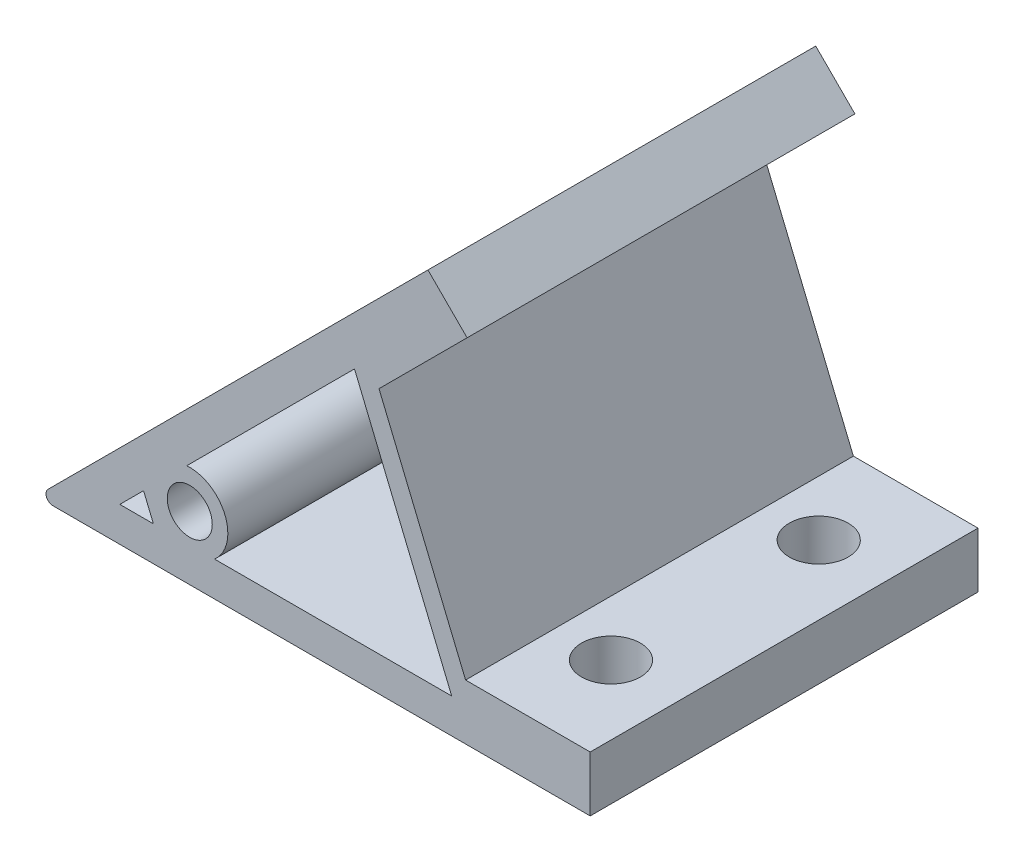
ISO-10303-21;
HEADER;
FILE_DESCRIPTION(('STEP AP214'),'2;1');
FILE_NAME('part.step','',(''),(''),'','','');
FILE_SCHEMA(('AUTOMOTIVE_DESIGN { 1 0 10303 214 1 1 1 1 }'));
ENDSEC;
DATA;
#1=APPLICATION_CONTEXT('core data for automotive mechanical design processes');
#2=APPLICATION_PROTOCOL_DEFINITION('international standard','automotive_design',2000,#1);
#3=PRODUCT_CONTEXT('',#1,'mechanical');
#4=PRODUCT('Part','Part','',(#3));
#5=PRODUCT_RELATED_PRODUCT_CATEGORY('part','',(#4));
#6=PRODUCT_DEFINITION_FORMATION('','',#4);
#7=PRODUCT_DEFINITION_CONTEXT('part definition',#1,'design');
#8=PRODUCT_DEFINITION('design','',#6,#7);
#9=PRODUCT_DEFINITION_SHAPE('','',#8);
#10=(LENGTH_UNIT() NAMED_UNIT(*) SI_UNIT(.MILLI.,.METRE.));
#11=(NAMED_UNIT(*) PLANE_ANGLE_UNIT() SI_UNIT($,.RADIAN.));
#12=(NAMED_UNIT(*) SI_UNIT($,.STERADIAN.) SOLID_ANGLE_UNIT());
#13=UNCERTAINTY_MEASURE_WITH_UNIT(LENGTH_MEASURE(1.E-05),#10,'distance_accuracy_value','');
#14=(GEOMETRIC_REPRESENTATION_CONTEXT(3) GLOBAL_UNCERTAINTY_ASSIGNED_CONTEXT((#13)) GLOBAL_UNIT_ASSIGNED_CONTEXT((#10,
#11,#12)) REPRESENTATION_CONTEXT('',''));
#15=CARTESIAN_POINT('',(0.,0.,0.));
#16=DIRECTION('',(0.,0.,1.));
#17=DIRECTION('',(1.,0.,0.));
#18=AXIS2_PLACEMENT_3D('',#15,#16,#17);
#19=CARTESIAN_POINT('',(-30.4993179415646,38.1869735594505,28.));
#20=DIRECTION('',(-0.707106781186548,0.707106781186547,0.));
#21=DIRECTION('',(-0.707106781186547,-0.707106781186548,0.));
#22=AXIS2_PLACEMENT_3D('',#19,#20,#21);
#23=PLANE('',#22);
#24=CARTESIAN_POINT('',(-24.8456710674492,43.8406204335659,15.));
#25=DIRECTION('',(-0.70710678118655,0.707106781186545,0.));
#26=DIRECTION('',(-0.707106781186546,-0.707106781186549,0.));
#27=AXIS2_PLACEMENT_3D('',#24,#25,#26);
#28=CIRCLE('',#27,4.25);
#29=CARTESIAN_POINT('',(-27.850874887492,40.835416613523,15.));
#30=VERTEX_POINT('',#29);
#31=EDGE_CURVE('E263',#30,#30,#28,.T.);
#32=ORIENTED_EDGE('',*,*,#31,.T.);
#33=EDGE_LOOP('',(#32));
#34=FACE_BOUND('',#33,.T.);
#35=DIRECTION('',(0.707106781186547,0.707106781186548,0.));
#36=VECTOR('',#35,1.);
#37=CARTESIAN_POINT('',(-30.4993179415646,38.1869735594505,-28.));
#38=LINE('',#37,#36);
#39=CARTESIAN_POINT('',(-30.4993179415646,38.1869735594505,-28.));
#40=VERTEX_POINT('',#39);
#41=CARTESIAN_POINT('',(-17.7746032555838,50.9116882454314,-28.));
#42=VERTEX_POINT('',#41);
#43=EDGE_CURVE('E237',#40,#42,#38,.T.);
#44=ORIENTED_EDGE('',*,*,#43,.T.);
#45=DIRECTION('',(0.,0.,-1.));
#46=VECTOR('',#45,1.);
#47=CARTESIAN_POINT('',(-17.7746032555838,50.9116882454314,28.));
#48=LINE('',#47,#46);
#49=CARTESIAN_POINT('',(-17.7746032555838,50.9116882454314,28.));
#50=VERTEX_POINT('',#49);
#51=EDGE_CURVE('E247',#50,#42,#48,.T.);
#52=ORIENTED_EDGE('',*,*,#51,.F.);
#53=DIRECTION('',(0.707106781186547,0.707106781186548,0.));
#54=VECTOR('',#53,1.);
#55=CARTESIAN_POINT('',(-30.4993179415646,38.1869735594505,28.));
#56=LINE('',#55,#54);
#57=CARTESIAN_POINT('',(-30.4993179415646,38.1869735594505,28.));
#58=VERTEX_POINT('',#57);
#59=EDGE_CURVE('E220',#58,#50,#56,.T.);
#60=ORIENTED_EDGE('',*,*,#59,.F.);
#61=DIRECTION('',(0.,0.,-1.));
#62=VECTOR('',#61,1.);
#63=CARTESIAN_POINT('',(-30.4993179415646,38.1869735594505,28.));
#64=LINE('',#63,#62);
#65=EDGE_CURVE('E250',#58,#40,#64,.T.);
#66=ORIENTED_EDGE('',*,*,#65,.T.);
#67=EDGE_LOOP('',(#44,#52,#60,#66));
#68=FACE_BOUND('',#67,.T.);
#69=CARTESIAN_POINT('',(-24.8456710674492,43.8406204335659,-15.));
#70=DIRECTION('',(-0.70710678118655,0.707106781186545,0.));
#71=DIRECTION('',(0.707106781186546,0.707106781186549,0.));
#72=AXIS2_PLACEMENT_3D('',#69,#70,#71);
#73=CIRCLE('',#72,4.25);
#74=CARTESIAN_POINT('',(-21.8404672474063,46.8458242536087,-15.));
#75=VERTEX_POINT('',#74);
#76=EDGE_CURVE('E274',#75,#75,#73,.T.);
#77=ORIENTED_EDGE('',*,*,#76,.T.);
#78=EDGE_LOOP('',(#77));
#79=FACE_BOUND('',#78,.T.);
#80=ADVANCED_FACE('F35',(#34,#68,#79),#23,.F.);
#81=CARTESIAN_POINT('',(-78.2928932188134,1.7071067811866,28.));
#82=DIRECTION('',(0.707106781186548,-0.707106781186548,0.));
#83=DIRECTION('',(0.707106781186547,0.707106781186548,0.));
#84=AXIS2_PLACEMENT_3D('',#81,#82,#83);
#85=PLANE('',#84);
#86=CARTESIAN_POINT('',(-30.5025253169417,49.4974746830583,15.));
#87=DIRECTION('',(0.707106781186548,-0.707106781186548,0.));
#88=DIRECTION('',(0.707106781186547,0.707106781186548,0.));
#89=AXIS2_PLACEMENT_3D('',#86,#87,#88);
#90=CIRCLE('',#89,4.25);
#91=CARTESIAN_POINT('',(-27.4973214968988,52.5026785031012,15.));
#92=VERTEX_POINT('',#91);
#93=EDGE_CURVE('E260',#92,#92,#90,.F.);
#94=ORIENTED_EDGE('',*,*,#93,.F.);
#95=EDGE_LOOP('',(#94));
#96=FACE_BOUND('',#95,.T.);
#97=DIRECTION('',(-0.707106781186547,-0.707106781186548,0.));
#98=VECTOR('',#97,1.);
#99=CARTESIAN_POINT('',(-78.2928932188134,1.7071067811866,-28.));
#100=LINE('',#99,#98);
#101=CARTESIAN_POINT('',(-23.4314575050762,56.5685424949238,-28.));
#102=VERTEX_POINT('',#101);
#103=CARTESIAN_POINT('',(-78.2928932188134,1.7071067811866,-28.));
#104=VERTEX_POINT('',#103);
#105=EDGE_CURVE('E212',#102,#104,#100,.T.);
#106=ORIENTED_EDGE('',*,*,#105,.T.);
#107=DIRECTION('',(0.,0.,-1.));
#108=VECTOR('',#107,1.);
#109=CARTESIAN_POINT('',(-78.2928932188134,1.7071067811866,28.));
#110=LINE('',#109,#108);
#111=CARTESIAN_POINT('',(-78.2928932188134,1.7071067811866,28.));
#112=VERTEX_POINT('',#111);
#113=EDGE_CURVE('E226',#112,#104,#110,.T.);
#114=ORIENTED_EDGE('',*,*,#113,.F.);
#115=DIRECTION('',(-0.707106781186547,-0.707106781186548,0.));
#116=VECTOR('',#115,1.);
#117=CARTESIAN_POINT('',(-78.2928932188134,1.7071067811866,28.));
#118=LINE('',#117,#116);
#119=CARTESIAN_POINT('',(-23.4314575050762,56.5685424949238,28.));
#120=VERTEX_POINT('',#119);
#121=EDGE_CURVE('E224',#120,#112,#118,.T.);
#122=ORIENTED_EDGE('',*,*,#121,.F.);
#123=DIRECTION('',(0.,0.,-1.));
#124=VECTOR('',#123,1.);
#125=CARTESIAN_POINT('',(-23.4314575050762,56.5685424949238,28.));
#126=LINE('',#125,#124);
#127=EDGE_CURVE('E244',#120,#102,#126,.T.);
#128=ORIENTED_EDGE('',*,*,#127,.T.);
#129=EDGE_LOOP('',(#106,#114,#122,#128));
#130=FACE_BOUND('',#129,.T.);
#131=CARTESIAN_POINT('',(-30.5025253169417,49.4974746830583,-15.));
#132=DIRECTION('',(0.707106781186548,-0.707106781186548,0.));
#133=DIRECTION('',(0.707106781186547,0.707106781186548,0.));
#134=AXIS2_PLACEMENT_3D('',#131,#132,#133);
#135=CIRCLE('',#134,4.25);
#136=CARTESIAN_POINT('',(-27.4973214968988,52.5026785031012,-15.));
#137=VERTEX_POINT('',#136);
#138=EDGE_CURVE('E39',#137,#137,#135,.F.);
#139=ORIENTED_EDGE('',*,*,#138,.F.);
#140=EDGE_LOOP('',(#139));
#141=FACE_BOUND('',#140,.T.);
#142=ADVANCED_FACE('F308',(#96,#130,#141),#85,.F.);
#143=CARTESIAN_POINT('',(-77.5857864376269,1.,28.));
#144=DIRECTION('',(0.,0.,1.));
#145=DIRECTION('',(1.,0.,0.));
#146=AXIS2_PLACEMENT_3D('',#143,#144,#145);
#147=PLANE('',#146);
#148=DIRECTION('',(1.,0.,0.));
#149=VECTOR('',#148,1.);
#150=CARTESIAN_POINT('',(-54.2574687525298,5.,28.));
#151=LINE('',#150,#149);
#152=CARTESIAN_POINT('',(-54.2574687525298,5.,28.));
#153=VERTEX_POINT('',#152);
#154=CARTESIAN_POINT('',(-20.,5.,28.));
#155=VERTEX_POINT('',#154);
#156=EDGE_CURVE('E152',#153,#155,#151,.T.);
#157=ORIENTED_EDGE('',*,*,#156,.F.);
#158=CARTESIAN_POINT('',(-57.8268912197291,9.18440237676214,28.));
#159=DIRECTION('',(0.,0.,-1.));
#160=DIRECTION('',(1.,0.,0.));
#161=AXIS2_PLACEMENT_3D('',#158,#159,#160);
#162=CIRCLE('',#161,5.49999999999996);
#163=CARTESIAN_POINT('',(-58.2617476840749,14.6671845040599,28.));
#164=VERTEX_POINT('',#163);
#165=EDGE_CURVE('E144',#164,#153,#162,.T.);
#166=ORIENTED_EDGE('',*,*,#165,.F.);
#167=DIRECTION('',(-0.707106781186549,-0.707106781186546,0.));
#168=VECTOR('',#167,1.);
#169=CARTESIAN_POINT('',(-58.2617476840749,14.6671845040599,28.));
#170=LINE('',#169,#168);
#171=CARTESIAN_POINT('',(-34.0380592228744,38.8908729652603,28.));
#172=VERTEX_POINT('',#171);
#173=EDGE_CURVE('E168',#172,#164,#170,.T.);
#174=ORIENTED_EDGE('',*,*,#173,.F.);
#175=DIRECTION('',(-0.382683432365087,0.923879532511288,0.));
#176=VECTOR('',#175,1.);
#177=CARTESIAN_POINT('',(-20.,5.,28.));
#178=LINE('',#177,#176);
#179=EDGE_CURVE('E166',#155,#172,#178,.T.);
#180=ORIENTED_EDGE('',*,*,#179,.F.);
#181=EDGE_LOOP('',(#157,#166,#174,#180));
#182=FACE_BOUND('',#181,.T.);
#183=CARTESIAN_POINT('',(-77.5857864376269,1.,28.));
#184=DIRECTION('',(0.,0.,1.));
#185=DIRECTION('',(1.,0.,0.));
#186=AXIS2_PLACEMENT_3D('',#183,#184,#185);
#187=CIRCLE('',#186,1.);
#188=CARTESIAN_POINT('',(-77.5857864376269,0.,28.));
#189=VERTEX_POINT('',#188);
#190=EDGE_CURVE('E208',#112,#189,#187,.T.);
#191=ORIENTED_EDGE('',*,*,#190,.T.);
#192=DIRECTION('',(1.,0.,0.));
#193=VECTOR('',#192,1.);
#194=CARTESIAN_POINT('',(-77.5857864376269,0.,28.));
#195=LINE('',#194,#193);
#196=CARTESIAN_POINT('',(0.,0.,28.));
#197=VERTEX_POINT('',#196);
#198=EDGE_CURVE('E211',#189,#197,#195,.T.);
#199=ORIENTED_EDGE('',*,*,#198,.T.);
#200=DIRECTION('',(0.,1.,0.));
#201=VECTOR('',#200,1.);
#202=CARTESIAN_POINT('',(0.,0.,28.));
#203=LINE('',#202,#201);
#204=CARTESIAN_POINT('',(0.,8.,28.));
#205=VERTEX_POINT('',#204);
#206=EDGE_CURVE('E214',#197,#205,#203,.T.);
#207=ORIENTED_EDGE('',*,*,#206,.T.);
#208=DIRECTION('',(-1.,0.,0.));
#209=VECTOR('',#208,1.);
#210=CARTESIAN_POINT('',(-17.995464086242,8.00000000000012,28.));
#211=LINE('',#210,#209);
#212=CARTESIAN_POINT('',(-17.995464086242,8.00000000000012,28.));
#213=VERTEX_POINT('',#212);
#214=EDGE_CURVE('E216',#205,#213,#211,.T.);
#215=ORIENTED_EDGE('',*,*,#214,.T.);
#216=DIRECTION('',(-0.382683432365096,0.923879532511284,0.));
#217=VECTOR('',#216,1.);
#218=CARTESIAN_POINT('',(-17.995464086242,8.00000000000012,28.));
#219=LINE('',#218,#217);
#220=EDGE_CURVE('E218',#213,#58,#219,.T.);
#221=ORIENTED_EDGE('',*,*,#220,.T.);
#222=ORIENTED_EDGE('',*,*,#59,.T.);
#223=DIRECTION('',(-0.707106781186548,0.707106781186547,0.));
#224=VECTOR('',#223,1.);
#225=CARTESIAN_POINT('',(-17.7746032555838,50.9116882454314,28.));
#226=LINE('',#225,#224);
#227=EDGE_CURVE('E222',#50,#120,#226,.T.);
#228=ORIENTED_EDGE('',*,*,#227,.T.);
#229=ORIENTED_EDGE('',*,*,#121,.T.);
#230=EDGE_LOOP('',(#191,#199,#207,#215,#221,#222,#228,#229));
#231=FACE_BOUND('',#230,.T.);
#232=DIRECTION('',(1.,0.,0.));
#233=VECTOR('',#232,1.);
#234=CARTESIAN_POINT('',(-67.9289321881347,5.,28.));
#235=LINE('',#234,#233);
#236=CARTESIAN_POINT('',(-67.9289321881347,5.,28.));
#237=VERTEX_POINT('',#236);
#238=CARTESIAN_POINT('',(-63.0744704704145,5.00000000000011,28.));
#239=VERTEX_POINT('',#238);
#240=EDGE_CURVE('E186',#237,#239,#235,.T.);
#241=ORIENTED_EDGE('',*,*,#240,.F.);
#242=DIRECTION('',(-0.70710678118656,-0.707106781186535,0.));
#243=VECTOR('',#242,1.);
#244=CARTESIAN_POINT('',(-67.9289321881347,5.,28.));
#245=LINE('',#244,#243);
#246=CARTESIAN_POINT('',(-64.4963093885244,8.43262279961016,28.));
#247=VERTEX_POINT('',#246);
#248=EDGE_CURVE('E184',#247,#237,#245,.T.);
#249=ORIENTED_EDGE('',*,*,#248,.F.);
#250=DIRECTION('',(-0.382683432365157,0.923879532511259,0.));
#251=VECTOR('',#250,1.);
#252=CARTESIAN_POINT('',(-63.0744704704145,5.00000000000011,28.));
#253=LINE('',#252,#251);
#254=EDGE_CURVE('E190',#239,#247,#253,.T.);
#255=ORIENTED_EDGE('',*,*,#254,.F.);
#256=EDGE_LOOP('',(#241,#249,#255));
#257=FACE_BOUND('',#256,.T.);
#258=CARTESIAN_POINT('',(-57.8268912197291,9.18440237676214,28.));
#259=DIRECTION('',(0.,0.,1.));
#260=DIRECTION('',(1.,0.,0.));
#261=AXIS2_PLACEMENT_3D('',#258,#259,#260);
#262=CIRCLE('',#261,3.25);
#263=CARTESIAN_POINT('',(-54.5768912197291,9.18440237676214,28.));
#264=VERTEX_POINT('',#263);
#265=EDGE_CURVE('E174',#264,#264,#262,.T.);
#266=ORIENTED_EDGE('',*,*,#265,.F.);
#267=EDGE_LOOP('',(#266));
#268=FACE_BOUND('',#267,.T.);
#269=ADVANCED_FACE('F164',(#182,#231,#257,#268),#147,.T.);
#270=CARTESIAN_POINT('',(-77.5857864376269,1.,-28.));
#271=DIRECTION('',(0.,0.,1.));
#272=DIRECTION('',(1.,0.,0.));
#273=AXIS2_PLACEMENT_3D('',#270,#271,#272);
#274=PLANE('',#273);
#275=CARTESIAN_POINT('',(-57.8268912197291,9.18440237676214,-28.));
#276=DIRECTION('',(0.,0.,-1.));
#277=DIRECTION('',(1.,0.,0.));
#278=AXIS2_PLACEMENT_3D('',#275,#276,#277);
#279=CIRCLE('',#278,5.49999999999996);
#280=CARTESIAN_POINT('',(-58.2617476840749,14.6671845040599,-28.));
#281=VERTEX_POINT('',#280);
#282=CARTESIAN_POINT('',(-54.2574687525298,5.,-28.));
#283=VERTEX_POINT('',#282);
#284=EDGE_CURVE('E60',#281,#283,#279,.T.);
#285=ORIENTED_EDGE('',*,*,#284,.T.);
#286=DIRECTION('',(1.,0.,0.));
#287=VECTOR('',#286,1.);
#288=CARTESIAN_POINT('',(-54.2574687525298,5.,-28.));
#289=LINE('',#288,#287);
#290=CARTESIAN_POINT('',(-20.,5.,-28.));
#291=VERTEX_POINT('',#290);
#292=EDGE_CURVE('E159',#283,#291,#289,.T.);
#293=ORIENTED_EDGE('',*,*,#292,.T.);
#294=DIRECTION('',(-0.382683432365087,0.923879532511288,0.));
#295=VECTOR('',#294,1.);
#296=CARTESIAN_POINT('',(-20.,5.,-28.));
#297=LINE('',#296,#295);
#298=CARTESIAN_POINT('',(-34.0380592228744,38.8908729652603,-28.));
#299=VERTEX_POINT('',#298);
#300=EDGE_CURVE('E176',#291,#299,#297,.T.);
#301=ORIENTED_EDGE('',*,*,#300,.T.);
#302=DIRECTION('',(-0.707106781186549,-0.707106781186546,0.));
#303=VECTOR('',#302,1.);
#304=CARTESIAN_POINT('',(-58.2617476840749,14.6671845040599,-28.));
#305=LINE('',#304,#303);
#306=EDGE_CURVE('E153',#299,#281,#305,.T.);
#307=ORIENTED_EDGE('',*,*,#306,.T.);
#308=EDGE_LOOP('',(#285,#293,#301,#307));
#309=FACE_BOUND('',#308,.T.);
#310=CARTESIAN_POINT('',(-77.5857864376269,1.,-28.));
#311=DIRECTION('',(0.,0.,1.));
#312=DIRECTION('',(1.,0.,0.));
#313=AXIS2_PLACEMENT_3D('',#310,#311,#312);
#314=CIRCLE('',#313,1.);
#315=CARTESIAN_POINT('',(-77.5857864376269,0.,-28.));
#316=VERTEX_POINT('',#315);
#317=EDGE_CURVE('E207',#104,#316,#314,.T.);
#318=ORIENTED_EDGE('',*,*,#317,.F.);
#319=ORIENTED_EDGE('',*,*,#105,.F.);
#320=DIRECTION('',(-0.707106781186548,0.707106781186547,0.));
#321=VECTOR('',#320,1.);
#322=CARTESIAN_POINT('',(-17.7746032555838,50.9116882454314,-28.));
#323=LINE('',#322,#321);
#324=EDGE_CURVE('E239',#42,#102,#323,.T.);
#325=ORIENTED_EDGE('',*,*,#324,.F.);
#326=ORIENTED_EDGE('',*,*,#43,.F.);
#327=DIRECTION('',(-0.382683432365096,0.923879532511284,0.));
#328=VECTOR('',#327,1.);
#329=CARTESIAN_POINT('',(-17.995464086242,8.00000000000012,-28.));
#330=LINE('',#329,#328);
#331=CARTESIAN_POINT('',(-17.995464086242,8.00000000000012,-28.));
#332=VERTEX_POINT('',#331);
#333=EDGE_CURVE('E235',#332,#40,#330,.T.);
#334=ORIENTED_EDGE('',*,*,#333,.F.);
#335=DIRECTION('',(-1.,0.,0.));
#336=VECTOR('',#335,1.);
#337=CARTESIAN_POINT('',(-17.995464086242,8.00000000000012,-28.));
#338=LINE('',#337,#336);
#339=CARTESIAN_POINT('',(0.,8.,-28.));
#340=VERTEX_POINT('',#339);
#341=EDGE_CURVE('E233',#340,#332,#338,.T.);
#342=ORIENTED_EDGE('',*,*,#341,.F.);
#343=DIRECTION('',(0.,1.,0.));
#344=VECTOR('',#343,1.);
#345=CARTESIAN_POINT('',(0.,0.,-28.));
#346=LINE('',#345,#344);
#347=CARTESIAN_POINT('',(0.,0.,-28.));
#348=VERTEX_POINT('',#347);
#349=EDGE_CURVE('E231',#348,#340,#346,.T.);
#350=ORIENTED_EDGE('',*,*,#349,.F.);
#351=DIRECTION('',(1.,0.,0.));
#352=VECTOR('',#351,1.);
#353=CARTESIAN_POINT('',(-77.5857864376269,0.,-28.));
#354=LINE('',#353,#352);
#355=EDGE_CURVE('E229',#316,#348,#354,.T.);
#356=ORIENTED_EDGE('',*,*,#355,.F.);
#357=EDGE_LOOP('',(#318,#319,#325,#326,#334,#342,#350,#356));
#358=FACE_BOUND('',#357,.T.);
#359=DIRECTION('',(-0.70710678118656,-0.707106781186535,0.));
#360=VECTOR('',#359,1.);
#361=CARTESIAN_POINT('',(-67.9289321881347,5.,-28.));
#362=LINE('',#361,#360);
#363=CARTESIAN_POINT('',(-64.4963093885244,8.43262279961016,-28.));
#364=VERTEX_POINT('',#363);
#365=CARTESIAN_POINT('',(-67.9289321881347,5.,-28.));
#366=VERTEX_POINT('',#365);
#367=EDGE_CURVE('E160',#364,#366,#362,.T.);
#368=ORIENTED_EDGE('',*,*,#367,.T.);
#369=DIRECTION('',(1.,0.,0.));
#370=VECTOR('',#369,1.);
#371=CARTESIAN_POINT('',(-67.9289321881347,5.,-28.));
#372=LINE('',#371,#370);
#373=CARTESIAN_POINT('',(-63.0744704704145,5.00000000000011,-28.));
#374=VERTEX_POINT('',#373);
#375=EDGE_CURVE('E195',#366,#374,#372,.T.);
#376=ORIENTED_EDGE('',*,*,#375,.T.);
#377=DIRECTION('',(-0.382683432365157,0.923879532511259,0.));
#378=VECTOR('',#377,1.);
#379=CARTESIAN_POINT('',(-63.0744704704145,5.00000000000011,-28.));
#380=LINE('',#379,#378);
#381=EDGE_CURVE('E187',#374,#364,#380,.T.);
#382=ORIENTED_EDGE('',*,*,#381,.T.);
#383=EDGE_LOOP('',(#368,#376,#382));
#384=FACE_BOUND('',#383,.T.);
#385=CARTESIAN_POINT('',(-57.8268912197291,9.18440237676214,-28.));
#386=DIRECTION('',(0.,0.,1.));
#387=DIRECTION('',(1.,0.,0.));
#388=AXIS2_PLACEMENT_3D('',#385,#386,#387);
#389=CIRCLE('',#388,3.25);
#390=CARTESIAN_POINT('',(-54.5768912197291,9.18440237676214,-28.));
#391=VERTEX_POINT('',#390);
#392=EDGE_CURVE('E285',#391,#391,#389,.T.);
#393=ORIENTED_EDGE('',*,*,#392,.T.);
#394=EDGE_LOOP('',(#393));
#395=FACE_BOUND('',#394,.T.);
#396=ADVANCED_FACE('F290',(#309,#358,#384,#395),#274,.F.);
#397=CARTESIAN_POINT('',(-77.5857864376269,1.,28.));
#398=DIRECTION('',(0.,0.,-1.));
#399=DIRECTION('',(-1.,0.,0.));
#400=AXIS2_PLACEMENT_3D('',#397,#398,#399);
#401=CYLINDRICAL_SURFACE('',#400,1.);
#402=ORIENTED_EDGE('',*,*,#317,.T.);
#403=DIRECTION('',(0.,0.,-1.));
#404=VECTOR('',#403,1.);
#405=CARTESIAN_POINT('',(-77.5857864376269,0.,28.));
#406=LINE('',#405,#404);
#407=EDGE_CURVE('E11',#189,#316,#406,.T.);
#408=ORIENTED_EDGE('',*,*,#407,.F.);
#409=ORIENTED_EDGE('',*,*,#190,.F.);
#410=ORIENTED_EDGE('',*,*,#113,.T.);
#411=EDGE_LOOP('',(#402,#408,#409,#410));
#412=FACE_BOUND('',#411,.T.);
#413=ADVANCED_FACE('F37',(#412),#401,.T.);
#414=CARTESIAN_POINT('',(-77.5857864376269,0.,28.));
#415=DIRECTION('',(0.,1.,0.));
#416=DIRECTION('',(0.,0.,1.));
#417=AXIS2_PLACEMENT_3D('',#414,#415,#416);
#418=PLANE('',#417);
#419=CARTESIAN_POINT('',(-10.,0.,-15.));
#420=DIRECTION('',(0.,1.,0.));
#421=DIRECTION('',(0.,0.,1.));
#422=AXIS2_PLACEMENT_3D('',#419,#420,#421);
#423=CIRCLE('',#422,4.25);
#424=CARTESIAN_POINT('',(-10.,0.,-10.75));
#425=VERTEX_POINT('',#424);
#426=EDGE_CURVE('E267',#425,#425,#423,.T.);
#427=ORIENTED_EDGE('',*,*,#426,.T.);
#428=EDGE_LOOP('',(#427));
#429=FACE_BOUND('',#428,.T.);
#430=CARTESIAN_POINT('',(-10.,0.,15.));
#431=DIRECTION('',(0.,1.,0.));
#432=DIRECTION('',(0.,0.,1.));
#433=AXIS2_PLACEMENT_3D('',#430,#431,#432);
#434=CIRCLE('',#433,4.25);
#435=CARTESIAN_POINT('',(-10.,0.,19.25));
#436=VERTEX_POINT('',#435);
#437=EDGE_CURVE('E282',#436,#436,#434,.T.);
#438=ORIENTED_EDGE('',*,*,#437,.T.);
#439=EDGE_LOOP('',(#438));
#440=FACE_BOUND('',#439,.T.);
#441=ORIENTED_EDGE('',*,*,#355,.T.);
#442=DIRECTION('',(0.,0.,-1.));
#443=VECTOR('',#442,1.);
#444=CARTESIAN_POINT('',(0.,0.,28.));
#445=LINE('',#444,#443);
#446=EDGE_CURVE('E44',#197,#348,#445,.T.);
#447=ORIENTED_EDGE('',*,*,#446,.F.);
#448=ORIENTED_EDGE('',*,*,#198,.F.);
#449=ORIENTED_EDGE('',*,*,#407,.T.);
#450=EDGE_LOOP('',(#441,#447,#448,#449));
#451=FACE_BOUND('',#450,.T.);
#452=ADVANCED_FACE('F329',(#429,#440,#451),#418,.F.);
#453=CARTESIAN_POINT('',(0.,0.,28.));
#454=DIRECTION('',(-1.,0.,0.));
#455=DIRECTION('',(0.,0.,1.));
#456=AXIS2_PLACEMENT_3D('',#453,#454,#455);
#457=PLANE('',#456);
#458=ORIENTED_EDGE('',*,*,#349,.T.);
#459=DIRECTION('',(0.,0.,-1.));
#460=VECTOR('',#459,1.);
#461=CARTESIAN_POINT('',(0.,8.,28.));
#462=LINE('',#461,#460);
#463=EDGE_CURVE('E256',#205,#340,#462,.T.);
#464=ORIENTED_EDGE('',*,*,#463,.F.);
#465=ORIENTED_EDGE('',*,*,#206,.F.);
#466=ORIENTED_EDGE('',*,*,#446,.T.);
#467=EDGE_LOOP('',(#458,#464,#465,#466));
#468=FACE_BOUND('',#467,.T.);
#469=ADVANCED_FACE('F326',(#468),#457,.F.);
#470=CARTESIAN_POINT('',(-17.995464086242,8.00000000000012,28.));
#471=DIRECTION('',(0.,-1.,0.));
#472=DIRECTION('',(1.,0.,0.));
#473=AXIS2_PLACEMENT_3D('',#470,#471,#472);
#474=PLANE('',#473);
#475=CARTESIAN_POINT('',(-10.,8.00000000000006,-15.));
#476=DIRECTION('',(0.,1.,0.));
#477=DIRECTION('',(1.,0.,0.));
#478=AXIS2_PLACEMENT_3D('',#475,#476,#477);
#479=CIRCLE('',#478,4.25);
#480=CARTESIAN_POINT('',(-5.75,8.00000000000004,-15.));
#481=VERTEX_POINT('',#480);
#482=EDGE_CURVE('E262',#481,#481,#479,.T.);
#483=ORIENTED_EDGE('',*,*,#482,.F.);
#484=EDGE_LOOP('',(#483));
#485=FACE_BOUND('',#484,.T.);
#486=CARTESIAN_POINT('',(-10.,8.00000000000006,15.));
#487=DIRECTION('',(0.,1.,0.));
#488=DIRECTION('',(-1.,0.,0.));
#489=AXIS2_PLACEMENT_3D('',#486,#487,#488);
#490=CIRCLE('',#489,4.25);
#491=CARTESIAN_POINT('',(-14.25,8.00000000000009,15.));
#492=VERTEX_POINT('',#491);
#493=EDGE_CURVE('E279',#492,#492,#490,.T.);
#494=ORIENTED_EDGE('',*,*,#493,.F.);
#495=EDGE_LOOP('',(#494));
#496=FACE_BOUND('',#495,.T.);
#497=ORIENTED_EDGE('',*,*,#341,.T.);
#498=DIRECTION('',(0.,0.,-1.));
#499=VECTOR('',#498,1.);
#500=CARTESIAN_POINT('',(-17.995464086242,8.00000000000012,28.));
#501=LINE('',#500,#499);
#502=EDGE_CURVE('E253',#213,#332,#501,.T.);
#503=ORIENTED_EDGE('',*,*,#502,.F.);
#504=ORIENTED_EDGE('',*,*,#214,.F.);
#505=ORIENTED_EDGE('',*,*,#463,.T.);
#506=EDGE_LOOP('',(#497,#503,#504,#505));
#507=FACE_BOUND('',#506,.T.);
#508=ADVANCED_FACE('F322',(#485,#496,#507),#474,.F.);
#509=CARTESIAN_POINT('',(-17.995464086242,8.00000000000012,28.));
#510=DIRECTION('',(-0.923879532511284,-0.382683432365096,0.));
#511=DIRECTION('',(0.382683432365096,-0.923879532511284,0.));
#512=AXIS2_PLACEMENT_3D('',#509,#510,#511);
#513=PLANE('',#512);
#514=ORIENTED_EDGE('',*,*,#333,.T.);
#515=ORIENTED_EDGE('',*,*,#65,.F.);
#516=ORIENTED_EDGE('',*,*,#220,.F.);
#517=ORIENTED_EDGE('',*,*,#502,.T.);
#518=EDGE_LOOP('',(#514,#515,#516,#517));
#519=FACE_BOUND('',#518,.T.);
#520=ADVANCED_FACE('F319',(#519),#513,.F.);
#521=CARTESIAN_POINT('',(-17.7746032555838,50.9116882454314,28.));
#522=DIRECTION('',(-0.707106781186547,-0.707106781186548,0.));
#523=DIRECTION('',(0.707106781186548,-0.707106781186547,0.));
#524=AXIS2_PLACEMENT_3D('',#521,#522,#523);
#525=PLANE('',#524);
#526=ORIENTED_EDGE('',*,*,#324,.T.);
#527=ORIENTED_EDGE('',*,*,#127,.F.);
#528=ORIENTED_EDGE('',*,*,#227,.F.);
#529=ORIENTED_EDGE('',*,*,#51,.T.);
#530=EDGE_LOOP('',(#526,#527,#528,#529));
#531=FACE_BOUND('',#530,.T.);
#532=ADVANCED_FACE('F318',(#531),#525,.F.);
#533=CARTESIAN_POINT('',(-67.9289321881347,5.,28.));
#534=DIRECTION('',(0.707106781186535,-0.70710678118656,0.));
#535=DIRECTION('',(0.70710678118656,0.707106781186535,0.));
#536=AXIS2_PLACEMENT_3D('',#533,#534,#535);
#537=PLANE('',#536);
#538=ORIENTED_EDGE('',*,*,#367,.F.);
#539=DIRECTION('',(0.,0.,-1.));
#540=VECTOR('',#539,1.);
#541=CARTESIAN_POINT('',(-64.4963093885244,8.43262279961016,28.));
#542=LINE('',#541,#540);
#543=EDGE_CURVE('E192',#247,#364,#542,.T.);
#544=ORIENTED_EDGE('',*,*,#543,.F.);
#545=ORIENTED_EDGE('',*,*,#248,.T.);
#546=DIRECTION('',(0.,0.,-1.));
#547=VECTOR('',#546,1.);
#548=CARTESIAN_POINT('',(-67.9289321881347,5.,28.));
#549=LINE('',#548,#547);
#550=EDGE_CURVE('E204',#237,#366,#549,.T.);
#551=ORIENTED_EDGE('',*,*,#550,.T.);
#552=EDGE_LOOP('',(#538,#544,#545,#551));
#553=FACE_BOUND('',#552,.T.);
#554=ADVANCED_FACE('F457',(#553),#537,.T.);
#555=CARTESIAN_POINT('',(-67.9289321881347,5.,28.));
#556=DIRECTION('',(0.,1.,0.));
#557=DIRECTION('',(-1.,0.,0.));
#558=AXIS2_PLACEMENT_3D('',#555,#556,#557);
#559=PLANE('',#558);
#560=ORIENTED_EDGE('',*,*,#375,.F.);
#561=ORIENTED_EDGE('',*,*,#550,.F.);
#562=ORIENTED_EDGE('',*,*,#240,.T.);
#563=DIRECTION('',(0.,0.,-1.));
#564=VECTOR('',#563,1.);
#565=CARTESIAN_POINT('',(-63.0744704704145,5.00000000000011,28.));
#566=LINE('',#565,#564);
#567=EDGE_CURVE('E202',#239,#374,#566,.T.);
#568=ORIENTED_EDGE('',*,*,#567,.T.);
#569=EDGE_LOOP('',(#560,#561,#562,#568));
#570=FACE_BOUND('',#569,.T.);
#571=ADVANCED_FACE('F465',(#570),#559,.T.);
#572=CARTESIAN_POINT('',(-63.0744704704145,5.00000000000011,28.));
#573=DIRECTION('',(-0.923879532511259,-0.382683432365157,0.));
#574=DIRECTION('',(0.382683432365157,-0.923879532511259,0.));
#575=AXIS2_PLACEMENT_3D('',#572,#573,#574);
#576=PLANE('',#575);
#577=ORIENTED_EDGE('',*,*,#381,.F.);
#578=ORIENTED_EDGE('',*,*,#567,.F.);
#579=ORIENTED_EDGE('',*,*,#254,.T.);
#580=ORIENTED_EDGE('',*,*,#543,.T.);
#581=EDGE_LOOP('',(#577,#578,#579,#580));
#582=FACE_BOUND('',#581,.T.);
#583=ADVANCED_FACE('F475',(#582),#576,.T.);
#584=CARTESIAN_POINT('',(-57.8268912197291,9.18440237676214,28.));
#585=DIRECTION('',(0.,0.,-1.));
#586=DIRECTION('',(-1.,0.,0.));
#587=AXIS2_PLACEMENT_3D('',#584,#585,#586);
#588=CYLINDRICAL_SURFACE('',#587,5.49999999999996);
#589=ORIENTED_EDGE('',*,*,#284,.F.);
#590=DIRECTION('',(0.,0.,-1.));
#591=VECTOR('',#590,1.);
#592=CARTESIAN_POINT('',(-58.2617476840749,14.6671845040599,28.));
#593=LINE('',#592,#591);
#594=EDGE_CURVE('E148',#164,#281,#593,.T.);
#595=ORIENTED_EDGE('',*,*,#594,.F.);
#596=ORIENTED_EDGE('',*,*,#165,.T.);
#597=DIRECTION('',(0.,0.,-1.));
#598=VECTOR('',#597,1.);
#599=CARTESIAN_POINT('',(-54.2574687525298,5.,28.));
#600=LINE('',#599,#598);
#601=EDGE_CURVE('E147',#153,#283,#600,.T.);
#602=ORIENTED_EDGE('',*,*,#601,.T.);
#603=EDGE_LOOP('',(#589,#595,#596,#602));
#604=FACE_BOUND('',#603,.T.);
#605=ADVANCED_FACE('F146',(#604),#588,.T.);
#606=CARTESIAN_POINT('',(-54.2574687525298,5.,28.));
#607=DIRECTION('',(0.,1.,0.));
#608=DIRECTION('',(0.,0.,1.));
#609=AXIS2_PLACEMENT_3D('',#606,#607,#608);
#610=PLANE('',#609);
#611=ORIENTED_EDGE('',*,*,#292,.F.);
#612=ORIENTED_EDGE('',*,*,#601,.F.);
#613=ORIENTED_EDGE('',*,*,#156,.T.);
#614=DIRECTION('',(0.,0.,-1.));
#615=VECTOR('',#614,1.);
#616=CARTESIAN_POINT('',(-20.,5.,28.));
#617=LINE('',#616,#615);
#618=EDGE_CURVE('E161',#155,#291,#617,.T.);
#619=ORIENTED_EDGE('',*,*,#618,.T.);
#620=EDGE_LOOP('',(#611,#612,#613,#619));
#621=FACE_BOUND('',#620,.T.);
#622=ADVANCED_FACE('F156',(#621),#610,.T.);
#623=CARTESIAN_POINT('',(-20.,5.,28.));
#624=DIRECTION('',(-0.923879532511288,-0.382683432365087,0.));
#625=DIRECTION('',(0.382683432365087,-0.923879532511288,0.));
#626=AXIS2_PLACEMENT_3D('',#623,#624,#625);
#627=PLANE('',#626);
#628=ORIENTED_EDGE('',*,*,#300,.F.);
#629=ORIENTED_EDGE('',*,*,#618,.F.);
#630=ORIENTED_EDGE('',*,*,#179,.T.);
#631=DIRECTION('',(0.,0.,-1.));
#632=VECTOR('',#631,1.);
#633=CARTESIAN_POINT('',(-34.0380592228744,38.8908729652603,28.));
#634=LINE('',#633,#632);
#635=EDGE_CURVE('E52',#172,#299,#634,.T.);
#636=ORIENTED_EDGE('',*,*,#635,.T.);
#637=EDGE_LOOP('',(#628,#629,#630,#636));
#638=FACE_BOUND('',#637,.T.);
#639=ADVANCED_FACE('F305',(#638),#627,.T.);
#640=CARTESIAN_POINT('',(-58.2617476840749,14.6671845040599,28.));
#641=DIRECTION('',(0.707106781186546,-0.707106781186549,0.));
#642=DIRECTION('',(0.707106781186549,0.707106781186546,0.));
#643=AXIS2_PLACEMENT_3D('',#640,#641,#642);
#644=PLANE('',#643);
#645=ORIENTED_EDGE('',*,*,#306,.F.);
#646=ORIENTED_EDGE('',*,*,#635,.F.);
#647=ORIENTED_EDGE('',*,*,#173,.T.);
#648=ORIENTED_EDGE('',*,*,#594,.T.);
#649=EDGE_LOOP('',(#645,#646,#647,#648));
#650=FACE_BOUND('',#649,.T.);
#651=ADVANCED_FACE('F295',(#650),#644,.T.);
#652=CARTESIAN_POINT('',(-57.8268912197291,9.18440237676214,28.));
#653=DIRECTION('',(0.,0.,-1.));
#654=DIRECTION('',(-1.,0.,0.));
#655=AXIS2_PLACEMENT_3D('',#652,#653,#654);
#656=CYLINDRICAL_SURFACE('',#655,3.25);
#657=ORIENTED_EDGE('',*,*,#265,.T.);
#658=EDGE_LOOP('',(#657));
#659=FACE_BOUND('',#658,.T.);
#660=ORIENTED_EDGE('',*,*,#392,.F.);
#661=EDGE_LOOP('',(#660));
#662=FACE_BOUND('',#661,.T.);
#663=ADVANCED_FACE('F292',(#659,#662),#656,.F.);
#664=CARTESIAN_POINT('',(-10.0000000000001,-8.99999999999994,15.));
#665=DIRECTION('',(0.,1.,0.));
#666=DIRECTION('',(-1.,0.,0.));
#667=AXIS2_PLACEMENT_3D('',#664,#665,#666);
#668=CYLINDRICAL_SURFACE('',#667,4.25);
#669=ORIENTED_EDGE('',*,*,#493,.T.);
#670=EDGE_LOOP('',(#669));
#671=FACE_BOUND('',#670,.T.);
#672=ORIENTED_EDGE('',*,*,#437,.F.);
#673=EDGE_LOOP('',(#672));
#674=FACE_BOUND('',#673,.T.);
#675=ADVANCED_FACE('F294',(#671,#674),#668,.F.);
#676=CARTESIAN_POINT('',(-10.0000000000001,-8.99999999999994,-15.));
#677=DIRECTION('',(0.,1.,0.));
#678=DIRECTION('',(-1.,0.,0.));
#679=AXIS2_PLACEMENT_3D('',#676,#677,#678);
#680=CYLINDRICAL_SURFACE('',#679,4.25);
#681=ORIENTED_EDGE('',*,*,#482,.T.);
#682=EDGE_LOOP('',(#681));
#683=FACE_BOUND('',#682,.T.);
#684=ORIENTED_EDGE('',*,*,#426,.F.);
#685=EDGE_LOOP('',(#684));
#686=FACE_BOUND('',#685,.T.);
#687=ADVANCED_FACE('F302',(#683,#686),#680,.F.);
#688=CARTESIAN_POINT('',(-36.8664863476205,55.8614357137372,15.));
#689=DIRECTION('',(0.70710678118655,-0.707106781186545,0.));
#690=DIRECTION('',(0.707106781186545,0.70710678118655,0.));
#691=AXIS2_PLACEMENT_3D('',#688,#689,#690);
#692=CYLINDRICAL_SURFACE('',#691,4.25);
#693=ORIENTED_EDGE('',*,*,#31,.F.);
#694=EDGE_LOOP('',(#693));
#695=FACE_BOUND('',#694,.T.);
#696=ORIENTED_EDGE('',*,*,#93,.T.);
#697=EDGE_LOOP('',(#696));
#698=FACE_BOUND('',#697,.T.);
#699=ADVANCED_FACE('F377',(#695,#698),#692,.F.);
#700=CARTESIAN_POINT('',(-36.8664863476205,55.8614357137372,-15.));
#701=DIRECTION('',(0.70710678118655,-0.707106781186545,0.));
#702=DIRECTION('',(0.707106781186545,0.70710678118655,0.));
#703=AXIS2_PLACEMENT_3D('',#700,#701,#702);
#704=CYLINDRICAL_SURFACE('',#703,4.25);
#705=ORIENTED_EDGE('',*,*,#76,.F.);
#706=EDGE_LOOP('',(#705));
#707=FACE_BOUND('',#706,.T.);
#708=ORIENTED_EDGE('',*,*,#138,.T.);
#709=EDGE_LOOP('',(#708));
#710=FACE_BOUND('',#709,.T.);
#711=ADVANCED_FACE('F374',(#707,#710),#704,.F.);
#712=CLOSED_SHELL('',(#80,#142,#269,#396,#413,#452,#469,#508,#520,#532,#554,#571,#583,#605,#622,
#639,#651,#663,#675,#687,#699,#711));
#713=MANIFOLD_SOLID_BREP('B2',#712);
#714=ADVANCED_BREP_SHAPE_REPRESENTATION('',(#18,#713),#14);
#715=SHAPE_DEFINITION_REPRESENTATION(#9,#714);
ENDSEC;
END-ISO-10303-21;
